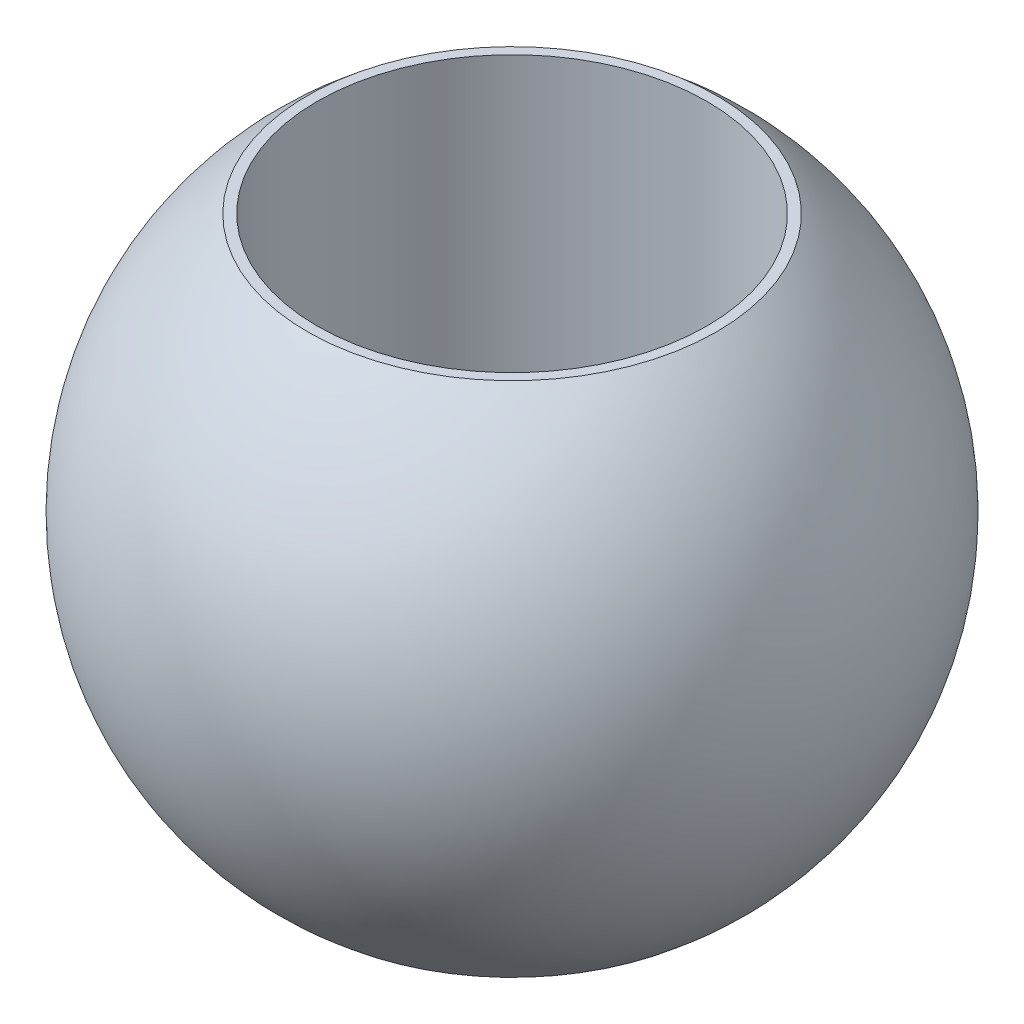
ISO-10303-21;
HEADER;
FILE_DESCRIPTION(('STEP AP214'),'2;1');
FILE_NAME('part.step','',(''),(''),'','','');
FILE_SCHEMA(('AUTOMOTIVE_DESIGN { 1 0 10303 214 1 1 1 1 }'));
ENDSEC;
DATA;
#1=APPLICATION_CONTEXT('core data for automotive mechanical design processes');
#2=APPLICATION_PROTOCOL_DEFINITION('international standard','automotive_design',2000,#1);
#3=PRODUCT_CONTEXT('',#1,'mechanical');
#4=PRODUCT('Part','Part','',(#3));
#5=PRODUCT_RELATED_PRODUCT_CATEGORY('part','',(#4));
#6=PRODUCT_DEFINITION_FORMATION('','',#4);
#7=PRODUCT_DEFINITION_CONTEXT('part definition',#1,'design');
#8=PRODUCT_DEFINITION('design','',#6,#7);
#9=PRODUCT_DEFINITION_SHAPE('','',#8);
#10=(LENGTH_UNIT() NAMED_UNIT(*) SI_UNIT(.MILLI.,.METRE.));
#11=(NAMED_UNIT(*) PLANE_ANGLE_UNIT() SI_UNIT($,.RADIAN.));
#12=(NAMED_UNIT(*) SI_UNIT($,.STERADIAN.) SOLID_ANGLE_UNIT());
#13=UNCERTAINTY_MEASURE_WITH_UNIT(LENGTH_MEASURE(1.E-05),#10,'distance_accuracy_value','');
#14=(GEOMETRIC_REPRESENTATION_CONTEXT(3) GLOBAL_UNCERTAINTY_ASSIGNED_CONTEXT((#13)) GLOBAL_UNIT_ASSIGNED_CONTEXT((#10,
#11,#12)) REPRESENTATION_CONTEXT('',''));
#15=CARTESIAN_POINT('',(0.,0.,0.));
#16=DIRECTION('',(0.,0.,1.));
#17=DIRECTION('',(1.,0.,0.));
#18=AXIS2_PLACEMENT_3D('',#15,#16,#17);
#19=CARTESIAN_POINT('',(0.,-11.,0.));
#20=DIRECTION('',(0.,1.,0.));
#21=DIRECTION('',(0.,0.,1.));
#22=AXIS2_PLACEMENT_3D('',#19,#20,#21);
#23=CYLINDRICAL_SURFACE('',#22,6.5);
#24=CARTESIAN_POINT('',(0.,8.62411967464942,0.));
#25=DIRECTION('',(0.,-1.,0.));
#26=DIRECTION('',(0.,0.,-1.));
#27=AXIS2_PLACEMENT_3D('',#24,#25,#26);
#28=CIRCLE('',#27,6.5);
#29=CARTESIAN_POINT('',(0.,8.62411967464942,-6.5));
#30=VERTEX_POINT('',#29);
#31=EDGE_CURVE('E41',#30,#30,#28,.F.);
#32=ORIENTED_EDGE('',*,*,#31,.T.);
#33=EDGE_LOOP('',(#32));
#34=FACE_BOUND('',#33,.T.);
#35=CARTESIAN_POINT('',(0.,-8.62411967464942,0.));
#36=DIRECTION('',(0.,1.,0.));
#37=DIRECTION('',(0.,0.,1.));
#38=AXIS2_PLACEMENT_3D('',#35,#36,#37);
#39=CIRCLE('',#38,6.5);
#40=CARTESIAN_POINT('',(0.,-8.62411967464942,6.5));
#41=VERTEX_POINT('',#40);
#42=EDGE_CURVE('E53',#41,#41,#39,.F.);
#43=ORIENTED_EDGE('',*,*,#42,.T.);
#44=EDGE_LOOP('',(#43));
#45=FACE_BOUND('',#44,.T.);
#46=ADVANCED_FACE('F37',(#34,#45),#23,.F.);
#47=CARTESIAN_POINT('',(-12.2006221275467,-8.62411967464942,-11.));
#48=DIRECTION('',(0.,1.,0.));
#49=DIRECTION('',(0.,0.,1.));
#50=AXIS2_PLACEMENT_3D('',#47,#48,#49);
#51=PLANE('',#50);
#52=ORIENTED_EDGE('',*,*,#42,.F.);
#53=EDGE_LOOP('',(#52));
#54=FACE_BOUND('',#53,.T.);
#55=CARTESIAN_POINT('',(0.,-8.62411967464942,0.));
#56=DIRECTION('',(0.,1.,0.));
#57=DIRECTION('',(0.,0.,1.));
#58=AXIS2_PLACEMENT_3D('',#55,#56,#57);
#59=CIRCLE('',#58,6.82821791079669);
#60=CARTESIAN_POINT('',(6.82821791079669,-8.62411967464942,0.));
#61=VERTEX_POINT('',#60);
#62=EDGE_CURVE('E51',#61,#61,#59,.T.);
#63=ORIENTED_EDGE('',*,*,#62,.F.);
#64=EDGE_LOOP('',(#63));
#65=FACE_BOUND('',#64,.T.);
#66=ADVANCED_FACE('F63',(#54,#65),#51,.F.);
#67=CARTESIAN_POINT('',(-11.4643776888155,8.62411967464942,-11.));
#68=DIRECTION('',(0.,-1.,0.));
#69=DIRECTION('',(0.,0.,-1.));
#70=AXIS2_PLACEMENT_3D('',#67,#68,#69);
#71=PLANE('',#70);
#72=ORIENTED_EDGE('',*,*,#31,.F.);
#73=EDGE_LOOP('',(#72));
#74=FACE_BOUND('',#73,.T.);
#75=CARTESIAN_POINT('',(0.,8.62411967464942,0.));
#76=DIRECTION('',(0.,-1.,0.));
#77=DIRECTION('',(0.,0.,-1.));
#78=AXIS2_PLACEMENT_3D('',#75,#76,#77);
#79=CIRCLE('',#78,6.82821791079669);
#80=CARTESIAN_POINT('',(6.82821791079669,8.62411967464942,0.));
#81=VERTEX_POINT('',#80);
#82=EDGE_CURVE('E10',#81,#81,#79,.T.);
#83=ORIENTED_EDGE('',*,*,#82,.F.);
#84=EDGE_LOOP('',(#83));
#85=FACE_BOUND('',#84,.T.);
#86=ADVANCED_FACE('F65',(#74,#85),#71,.F.);
#87=CARTESIAN_POINT('',(0.,0.,0.));
#88=DIRECTION('',(0.,1.,0.));
#89=DIRECTION('',(1.,0.,0.));
#90=AXIS2_PLACEMENT_3D('',#87,#88,#89);
#91=SPHERICAL_SURFACE('',#90,11.);
#92=CARTESIAN_POINT('',(6.82821791079669,8.62411967464942,0.));
#93=CARTESIAN_POINT('',(6.99012237384494,8.49593891504403,0.));
#94=CARTESIAN_POINT('',(7.14840863218372,8.3631893605651,0.));
#95=CARTESIAN_POINT('',(7.45726212256413,8.08899535162139,0.));
#96=CARTESIAN_POINT('',(7.60782935460576,7.94755089715661,0.));
#97=CARTESIAN_POINT('',(7.90076217551367,7.65640977800237,0.));
#98=CARTESIAN_POINT('',(8.04312776437994,7.50671311331293,0.));
#99=CARTESIAN_POINT('',(8.31920724777223,7.19954381869051,0.));
#100=CARTESIAN_POINT('',(8.45292114229825,7.04207118875753,0.));
#101=CARTESIAN_POINT('',(8.71127286276087,6.71984888646062,0.));
#102=CARTESIAN_POINT('',(8.83591068869747,6.55509921409668,0.));
#103=CARTESIAN_POINT('',(9.07571514856404,6.21884535545371,0.));
#104=CARTESIAN_POINT('',(9.19088178249401,6.04734116917467,0.));
#105=CARTESIAN_POINT('',(9.41137864163244,5.69812208746102,0.));
#106=CARTESIAN_POINT('',(9.5167088668409,5.52040719202642,0.));
#107=CARTESIAN_POINT('',(9.71719891659562,5.15933022882153,0.));
#108=CARTESIAN_POINT('',(9.81235874114189,4.97596816105123,0.));
#109=CARTESIAN_POINT('',(9.99220623861789,4.60417828681024,0.));
#110=CARTESIAN_POINT('',(10.0768939115476,4.41575048033955,0.));
#111=CARTESIAN_POINT('',(10.2355285641522,4.03442662837753,0.));
#112=CARTESIAN_POINT('',(10.309475543827,3.84153058288621,0.));
#113=CARTESIAN_POINT('',(10.4463943260592,3.45188192048624,0.));
#114=CARTESIAN_POINT('',(10.5093661286167,3.2551293035776,0.));
#115=CARTESIAN_POINT('',(10.6241348748941,2.85839139521857,0.));
#116=CARTESIAN_POINT('',(10.6759318186139,2.65840610376818,0.));
#117=CARTESIAN_POINT('',(10.768186600602,2.25583699386573,0.));
#118=CARTESIAN_POINT('',(10.8086444388702,2.05325317541367,0.));
#119=CARTESIAN_POINT('',(10.8780927193274,1.64612939891568,0.));
#120=CARTESIAN_POINT('',(10.9070831615164,1.44158944086976,0.));
#121=CARTESIAN_POINT('',(10.9535047219642,1.03120197544994,0.));
#122=CARTESIAN_POINT('',(10.970935840223,0.825354468076036,0.));
#123=CARTESIAN_POINT('',(10.9941834792409,0.41300464046809,0.));
#124=CARTESIAN_POINT('',(11.,0.206502320234045,0.));
#125=CARTESIAN_POINT('',(11.,-0.206502320234045,0.));
#126=CARTESIAN_POINT('',(10.9941834792409,-0.41300464046809,0.));
#127=CARTESIAN_POINT('',(10.970935840223,-0.825354468076036,0.));
#128=CARTESIAN_POINT('',(10.9535047219642,-1.03120197544994,0.));
#129=CARTESIAN_POINT('',(10.9070831615164,-1.44158944086976,0.));
#130=CARTESIAN_POINT('',(10.8780927193274,-1.64612939891568,0.));
#131=CARTESIAN_POINT('',(10.8086444388702,-2.05325317541367,0.));
#132=CARTESIAN_POINT('',(10.768186600602,-2.25583699386573,0.));
#133=CARTESIAN_POINT('',(10.6759318186139,-2.65840610376818,0.));
#134=CARTESIAN_POINT('',(10.6241348748941,-2.85839139521857,0.));
#135=CARTESIAN_POINT('',(10.5093661286167,-3.2551293035776,0.));
#136=CARTESIAN_POINT('',(10.4463943260592,-3.45188192048624,0.));
#137=CARTESIAN_POINT('',(10.309475543827,-3.84153058288621,0.));
#138=CARTESIAN_POINT('',(10.2355285641522,-4.03442662837754,0.));
#139=CARTESIAN_POINT('',(10.0768939115476,-4.41575048033955,0.));
#140=CARTESIAN_POINT('',(9.99220623861788,-4.60417828681024,0.));
#141=CARTESIAN_POINT('',(9.81235874114189,-4.97596816105123,0.));
#142=CARTESIAN_POINT('',(9.71719891659562,-5.15933022882153,0.));
#143=CARTESIAN_POINT('',(9.5167088668409,-5.52040719202642,0.));
#144=CARTESIAN_POINT('',(9.41137864163244,-5.69812208746102,0.));
#145=CARTESIAN_POINT('',(9.19088178249401,-6.04734116917466,0.));
#146=CARTESIAN_POINT('',(9.07571514856404,-6.21884535545371,0.));
#147=CARTESIAN_POINT('',(8.83591068869747,-6.55509921409669,0.));
#148=CARTESIAN_POINT('',(8.71127286276087,-6.71984888646062,0.));
#149=CARTESIAN_POINT('',(8.45292114229825,-7.04207118875753,0.));
#150=CARTESIAN_POINT('',(8.31920724777223,-7.19954381869051,0.));
#151=CARTESIAN_POINT('',(8.04312776437994,-7.50671311331293,0.));
#152=CARTESIAN_POINT('',(7.90076217551367,-7.65640977800237,0.));
#153=CARTESIAN_POINT('',(7.60782935460576,-7.94755089715661,0.));
#154=CARTESIAN_POINT('',(7.45726212256413,-8.08899535162139,0.));
#155=CARTESIAN_POINT('',(7.14840863218372,-8.3631893605651,0.));
#156=CARTESIAN_POINT('',(6.99012237384494,-8.49593891504403,0.));
#157=CARTESIAN_POINT('',(6.82821791079669,-8.62411967464942,0.));
#158=B_SPLINE_CURVE_WITH_KNOTS('',3,(#92,#93,#94,#95,#96,#97,#98,#99,#100,#101,#102,#103,#104,
#105,#106,#107,#108,#109,#110,#111,#112,#113,#114,#115,#116,#117,#118,#119,#120,#121,#122,#123,
#124,#125,#126,#127,#128,#129,#130,#131,#132,#133,#134,#135,#136,#137,#138,#139,#140,#141,#142,
#143,#144,#145,#146,#147,#148,#149,#150,#151,#152,#153,#154,#155,#156,#157),.UNSPECIFIED.,.F.,
.F.,(4,2,2,2,2,2,2,2,2,2,2,2,2,2,2,2,2,2,2,2,2,2,2,2,2,2,2,2,2,2,2,2,4),(0.,0.619425125335756,
1.23885025067151,1.85827537600727,2.47770050134302,3.09712562667878,3.71655075201453,
4.33597587735029,4.95540100268604,5.5748261280218,6.19425125335755,6.81367637869331,
7.43310150402906,8.05252662936481,8.67195175470057,9.29137688003633,9.91080200537208,
10.5302271307078,11.1496522560436,11.7690773813793,12.3885025067151,13.0079276320509,
13.6273527573866,14.2467778827224,14.8662030080581,15.4856281333939,16.1050532587296,
16.7244783840654,17.3439035094011,17.9633286347369,18.5827537600727,19.2021788854084,
19.8216040107442),.UNSPECIFIED.);
#159=EDGE_CURVE('BSEAM39',#81,#61,#158,.T.);
#160=ORIENTED_EDGE('',*,*,#82,.T.);
#161=ORIENTED_EDGE('',*,*,#62,.T.);
#162=ORIENTED_EDGE('',*,*,#159,.T.);
#163=ORIENTED_EDGE('',*,*,#159,.F.);
#164=EDGE_LOOP('',(#160,#162,#161,#163));
#165=FACE_BOUND('',#164,.T.);
#166=ADVANCED_FACE('F39',(#165),#91,.T.);
#167=CLOSED_SHELL('',(#46,#66,#86,#166));
#168=MANIFOLD_SOLID_BREP('B2',#167);
#169=ADVANCED_BREP_SHAPE_REPRESENTATION('',(#18,#168),#14);
#170=SHAPE_DEFINITION_REPRESENTATION(#9,#169);
ENDSEC;
END-ISO-10303-21;
